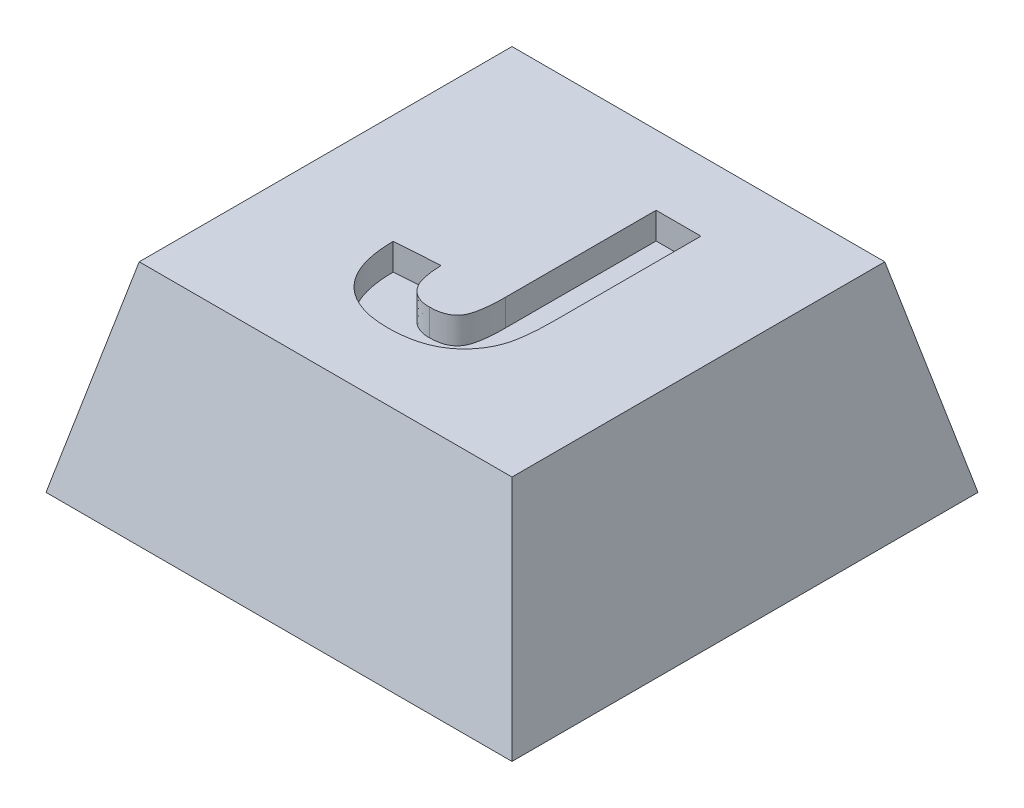
ISO-10303-21;
HEADER;
FILE_DESCRIPTION(('STEP AP214'),'2;1');
FILE_NAME('part.step','',(''),(''),'','','');
FILE_SCHEMA(('AUTOMOTIVE_DESIGN { 1 0 10303 214 1 1 1 1 }'));
ENDSEC;
DATA;
#1=APPLICATION_CONTEXT('core data for automotive mechanical design processes');
#2=APPLICATION_PROTOCOL_DEFINITION('international standard','automotive_design',2000,#1);
#3=PRODUCT_CONTEXT('',#1,'mechanical');
#4=PRODUCT('Part','Part','',(#3));
#5=PRODUCT_RELATED_PRODUCT_CATEGORY('part','',(#4));
#6=PRODUCT_DEFINITION_FORMATION('','',#4);
#7=PRODUCT_DEFINITION_CONTEXT('part definition',#1,'design');
#8=PRODUCT_DEFINITION('design','',#6,#7);
#9=PRODUCT_DEFINITION_SHAPE('','',#8);
#10=(LENGTH_UNIT() NAMED_UNIT(*) SI_UNIT(.MILLI.,.METRE.));
#11=(NAMED_UNIT(*) PLANE_ANGLE_UNIT() SI_UNIT($,.RADIAN.));
#12=(NAMED_UNIT(*) SI_UNIT($,.STERADIAN.) SOLID_ANGLE_UNIT());
#13=UNCERTAINTY_MEASURE_WITH_UNIT(LENGTH_MEASURE(1.E-05),#10,'distance_accuracy_value','');
#14=(GEOMETRIC_REPRESENTATION_CONTEXT(3) GLOBAL_UNCERTAINTY_ASSIGNED_CONTEXT((#13)) GLOBAL_UNIT_ASSIGNED_CONTEXT((#10,
#11,#12)) REPRESENTATION_CONTEXT('',''));
#15=CARTESIAN_POINT('',(0.,0.,0.));
#16=DIRECTION('',(0.,0.,1.));
#17=DIRECTION('',(1.,0.,0.));
#18=AXIS2_PLACEMENT_3D('',#15,#16,#17);
#19=CARTESIAN_POINT('',(0.,3.,0.));
#20=DIRECTION('',(0.,-1.,0.));
#21=DIRECTION('',(0.,0.,-1.));
#22=AXIS2_PLACEMENT_3D('',#19,#20,#21);
#23=PLANE('',#22);
#24=DIRECTION('',(-1.,0.,0.));
#25=VECTOR('',#24,1.);
#26=CARTESIAN_POINT('',(11.,3.,-0.7));
#27=LINE('',#26,#25);
#28=CARTESIAN_POINT('',(6.3,3.,-0.7));
#29=VERTEX_POINT('',#28);
#30=CARTESIAN_POINT('',(0.7,3.,-0.7));
#31=VERTEX_POINT('',#30);
#32=EDGE_CURVE('E65',#29,#31,#27,.T.);
#33=ORIENTED_EDGE('',*,*,#32,.F.);
#34=DIRECTION('',(0.,0.,1.));
#35=VECTOR('',#34,1.);
#36=CARTESIAN_POINT('',(6.3,3.,-7.));
#37=LINE('',#36,#35);
#38=CARTESIAN_POINT('',(6.3,3.,-6.3));
#39=VERTEX_POINT('',#38);
#40=EDGE_CURVE('E194',#39,#29,#37,.T.);
#41=ORIENTED_EDGE('',*,*,#40,.F.);
#42=DIRECTION('',(-1.,0.,0.));
#43=VECTOR('',#42,1.);
#44=CARTESIAN_POINT('',(11.,3.,-6.3));
#45=LINE('',#44,#43);
#46=CARTESIAN_POINT('',(0.699999999999998,3.,-6.3));
#47=VERTEX_POINT('',#46);
#48=EDGE_CURVE('E181',#39,#47,#45,.T.);
#49=ORIENTED_EDGE('',*,*,#48,.T.);
#50=DIRECTION('',(0.,0.,1.));
#51=VECTOR('',#50,1.);
#52=CARTESIAN_POINT('',(0.7,3.,-7.));
#53=LINE('',#52,#51);
#54=EDGE_CURVE('E195',#47,#31,#53,.T.);
#55=ORIENTED_EDGE('',*,*,#54,.T.);
#56=EDGE_LOOP('',(#33,#41,#49,#55));
#57=FACE_BOUND('',#56,.T.);
#58=DIRECTION('',(0.,0.,-1.));
#59=VECTOR('',#58,1.);
#60=CARTESIAN_POINT('',(3.91206739877753,3.,-2.98721086469881));
#61=LINE('',#60,#59);
#62=CARTESIAN_POINT('',(3.91206739877753,3.,-2.98721086469881));
#63=VERTEX_POINT('',#62);
#64=CARTESIAN_POINT('',(3.91206739877753,3.,-5.25253538392958));
#65=VERTEX_POINT('',#64);
#66=EDGE_CURVE('E58',#63,#65,#61,.T.);
#67=ORIENTED_EDGE('',*,*,#66,.T.);
#68=DIRECTION('',(1.,0.,0.));
#69=VECTOR('',#68,1.);
#70=CARTESIAN_POINT('',(3.91206739877753,3.,-5.25253538392958));
#71=LINE('',#70,#69);
#72=CARTESIAN_POINT('',(4.58514432185445,3.,-5.25253538392958));
#73=VERTEX_POINT('',#72);
#74=EDGE_CURVE('E165',#65,#73,#71,.T.);
#75=ORIENTED_EDGE('',*,*,#74,.T.);
#76=DIRECTION('',(0.,0.,1.));
#77=VECTOR('',#76,1.);
#78=CARTESIAN_POINT('',(4.58514432185445,3.,-5.25253538392958));
#79=LINE('',#78,#77);
#80=CARTESIAN_POINT('',(4.58514432185445,3.,-3.04610509546804));
#81=VERTEX_POINT('',#80);
#82=EDGE_CURVE('E522',#73,#81,#79,.T.);
#83=ORIENTED_EDGE('',*,*,#82,.T.);
#84=CARTESIAN_POINT('',(4.58514432185445,3.,-3.04610509546804));
#85=CARTESIAN_POINT('',(4.58484354051069,3.,-3.01104571157729));
#86=CARTESIAN_POINT('',(4.58425987213727,3.,-2.94301272351985));
#87=CARTESIAN_POINT('',(4.58067350615085,3.,-2.84412773321802));
#88=CARTESIAN_POINT('',(4.57533759844862,3.,-2.75151026547932));
#89=CARTESIAN_POINT('',(4.56712913665262,3.,-2.66517361345126));
#90=CARTESIAN_POINT('',(4.55556294752057,3.,-2.58530441611173));
#91=CARTESIAN_POINT('',(4.54330520071531,3.,-2.51126557935449));
#92=CARTESIAN_POINT('',(4.52842281599445,3.,-2.44343130714472));
#93=CARTESIAN_POINT('',(4.51508659844859,3.,-2.40099346894503));
#94=CARTESIAN_POINT('',(4.50872204621343,3.,-2.38074051213471));
#95=B_SPLINE_CURVE_WITH_KNOTS('',3,(#84,#85,#86,#87,#88,#89,#90,#91,#92,#93,#94),.UNSPECIFIED.,
.F.,.F.,(4,1,1,1,1,1,1,1,4),(0.,0.156452495119164,0.303597198546585,0.441515756123934,
0.57040444623701,0.690463066411907,0.801567510862614,0.905300439354284,1.),.UNSPECIFIED.);
#96=CARTESIAN_POINT('',(4.50872204621343,3.,-2.38074051213471));
#97=VERTEX_POINT('',#96);
#98=EDGE_CURVE('E517',#81,#97,#95,.T.);
#99=ORIENTED_EDGE('',*,*,#98,.T.);
#100=CARTESIAN_POINT('',(4.50872204621343,3.,-2.38074051213471));
#101=CARTESIAN_POINT('',(4.49982751326346,3.,-2.35578335197884));
#102=CARTESIAN_POINT('',(4.48222471894683,3.,-2.30639169089646));
#103=CARTESIAN_POINT('',(4.44801051336958,3.,-2.23593659718174));
#104=CARTESIAN_POINT('',(4.40866594413401,3.,-2.16923485230259));
#105=CARTESIAN_POINT('',(4.36430174050741,3.,-2.10599739743109));
#106=CARTESIAN_POINT('',(4.31533694466727,3.,-2.04597069021207));
#107=CARTESIAN_POINT('',(4.26011075922921,3.,-1.99073689447542));
#108=CARTESIAN_POINT('',(4.20056589190549,3.,-1.93836941226635));
#109=CARTESIAN_POINT('',(4.13502741336027,3.,-1.89103820407625));
#110=CARTESIAN_POINT('',(4.06514475981321,3.,-1.84690714592185));
#111=CARTESIAN_POINT('',(3.98892723647851,3.,-1.81013891859891));
#112=CARTESIAN_POINT('',(3.90787445383457,3.,-1.77833391503347));
#113=CARTESIAN_POINT('',(3.82130615826096,3.,-1.75250062571584));
#114=CARTESIAN_POINT('',(3.72919724773486,3.,-1.7322876400651));
#115=CARTESIAN_POINT('',(3.6317836932548,3.,-1.71757523362619));
#116=CARTESIAN_POINT('',(3.52893572474956,3.,-1.70921534010168));
#117=CARTESIAN_POINT('',(3.45869046084753,3.,-1.70818944091935));
#118=CARTESIAN_POINT('',(3.42268438595702,3.,-1.70766358905778));
#119=B_SPLINE_CURVE_WITH_KNOTS('',3,(#100,#101,#102,#103,#104,#105,#106,#107,#108,#109,#110,
#111,#112,#113,#114,#115,#116,#117,#118),.UNSPECIFIED.,.F.,.F.,(4,1,1,1,1,1,1,1,1,1,1,1,1,1,1,1,
4),(0.,0.0578458170130584,0.114480212135457,0.170784536242213,0.226875480201814,
0.283096404177707,0.339779109412981,0.397319931612097,0.456142184292489,0.516216371074673,
0.577640129433395,0.640691136416188,0.706271339139874,0.77477558408517,0.846550476911843,
0.921345373149547,1.),.UNSPECIFIED.);
#120=CARTESIAN_POINT('',(3.42268438595702,3.,-1.70766358905778));
#121=VERTEX_POINT('',#120);
#122=EDGE_CURVE('E507',#97,#121,#119,.T.);
#123=ORIENTED_EDGE('',*,*,#122,.T.);
#124=CARTESIAN_POINT('',(3.42268438595702,3.,-1.70766358905778));
#125=CARTESIAN_POINT('',(3.38058390407083,3.,-1.70868113625124));
#126=CARTESIAN_POINT('',(3.29873676866269,3.,-1.71065933980607));
#127=CARTESIAN_POINT('',(3.17971535800611,3.,-1.72379280482546));
#128=CARTESIAN_POINT('',(3.06809956119844,3.,-1.74676378840266));
#129=CARTESIAN_POINT('',(2.96422523456699,3.,-1.77994329234022));
#130=CARTESIAN_POINT('',(2.8670309569123,3.,-1.82118860041089));
#131=CARTESIAN_POINT('',(2.77769230806682,3.,-1.87263646132011));
#132=CARTESIAN_POINT('',(2.69573448445627,3.,-1.93325468982276));
#133=CARTESIAN_POINT('',(2.62169043984679,3.,-2.0032290785534));
#134=CARTESIAN_POINT('',(2.5555235708422,3.,-2.08185201462364));
#135=CARTESIAN_POINT('',(2.49840973269658,3.,-2.16981331462645));
#136=CARTESIAN_POINT('',(2.44993529695146,3.,-2.26619310147599));
#137=CARTESIAN_POINT('',(2.410873172898,3.,-2.37142739367569));
#138=CARTESIAN_POINT('',(2.3800335394126,3.,-2.48501237559787));
#139=CARTESIAN_POINT('',(2.35778934641552,3.,-2.60718720348745));
#140=CARTESIAN_POINT('',(2.34451597483478,3.,-2.73802144362846));
#141=CARTESIAN_POINT('',(2.34256059239478,3.,-2.82802487656406));
#142=CARTESIAN_POINT('',(2.34155457826471,3.,-2.87433025572445));
#143=B_SPLINE_CURVE_WITH_KNOTS('',3,(#124,#125,#126,#127,#128,#129,#130,#131,#132,#133,#134,
#135,#136,#137,#138,#139,#140,#141,#142),.UNSPECIFIED.,.F.,.F.,(4,1,1,1,1,1,1,1,1,1,1,1,1,1,1,1,
4),(0.,0.0696292858637476,0.135365614195809,0.197756356389333,0.257779246829448,
0.315436810851021,0.372058901761518,0.427875728209648,0.483657745283362,0.540176831628514,
0.597427412819986,0.65672025189341,0.718247696480561,0.782762362646519,0.851147772011753,
0.923417822731318,1.),.UNSPECIFIED.);
#144=CARTESIAN_POINT('',(2.34155457826471,3.,-2.87433025572445));
#145=VERTEX_POINT('',#144);
#146=EDGE_CURVE('E516',#121,#145,#143,.T.);
#147=ORIENTED_EDGE('',*,*,#146,.T.);
#148=DIRECTION('',(0.997785157856609,0.,-0.0665190105237732));
#149=VECTOR('',#148,1.);
#150=CARTESIAN_POINT('',(2.34155457826471,3.,-2.87433025572445));
#151=LINE('',#150,#149);
#152=CARTESIAN_POINT('',(3.01463150134163,3.,-2.91920205059624));
#153=VERTEX_POINT('',#152);
#154=EDGE_CURVE('E543',#145,#153,#151,.T.);
#155=ORIENTED_EDGE('',*,*,#154,.T.);
#156=CARTESIAN_POINT('',(3.01463150134163,3.,-2.91920205059624));
#157=CARTESIAN_POINT('',(3.01584036358571,3.,-2.89441584948431));
#158=CARTESIAN_POINT('',(3.01815842472874,3.,-2.846886918903));
#159=CARTESIAN_POINT('',(3.02459488525032,3.,-2.77837183449129));
#160=CARTESIAN_POINT('',(3.03273391836232,3.,-2.71539844353878));
#161=CARTESIAN_POINT('',(3.04338367481644,3.,-2.65815575709446));
#162=CARTESIAN_POINT('',(3.05485228726694,3.,-2.6061600898452));
#163=CARTESIAN_POINT('',(3.06975019425514,3.,-2.56043470110315));
#164=CARTESIAN_POINT('',(3.08541230352029,3.,-2.51937174878556));
#165=CARTESIAN_POINT('',(3.09916890630787,3.,-2.49534664863771));
#166=CARTESIAN_POINT('',(3.10577733467497,3.,-2.48380541598086));
#167=B_SPLINE_CURVE_WITH_KNOTS('',3,(#156,#157,#158,#159,#160,#161,#162,#163,#164,#165,#166),
.UNSPECIFIED.,.F.,.F.,(4,1,1,1,1,1,1,1,4),(0.,0.165826153270336,0.317980948018503,
0.459795738565098,0.589996550393839,0.707065953418222,0.815243566739462,0.911246281264676,1.),.UNSPECIFIED.);
#168=CARTESIAN_POINT('',(3.10577733467497,3.,-2.48380541598086));
#169=VERTEX_POINT('',#168);
#170=EDGE_CURVE('E550',#153,#169,#167,.T.);
#171=ORIENTED_EDGE('',*,*,#170,.T.);
#172=CARTESIAN_POINT('',(3.10577733467497,3.,-2.48380541598086));
#173=CARTESIAN_POINT('',(3.11589416626289,3.,-2.46854068254458));
#174=CARTESIAN_POINT('',(3.1358053509234,3.,-2.43849778585288));
#175=CARTESIAN_POINT('',(3.17212863049855,3.,-2.39934873072918));
#176=CARTESIAN_POINT('',(3.21112528718598,3.,-2.36512243873319));
#177=CARTESIAN_POINT('',(3.2549286769612,3.,-2.3382137089091));
#178=CARTESIAN_POINT('',(3.3023195286539,3.,-2.3170508020788));
#179=CARTESIAN_POINT('',(3.35365359949676,3.,-2.30167304466432));
#180=CARTESIAN_POINT('',(3.40878935654382,3.,-2.29234869756563));
#181=CARTESIAN_POINT('',(3.44671897227432,3.,-2.29145490016832));
#182=CARTESIAN_POINT('',(3.46615393723907,3.,-2.29099692239112));
#183=B_SPLINE_CURVE_WITH_KNOTS('',3,(#172,#173,#174,#175,#176,#177,#178,#179,#180,#181,#182),
.UNSPECIFIED.,.F.,.F.,(4,1,1,1,1,1,1,1,4),(0.,0.127957288456737,0.251835881320902,
0.372465314870914,0.490006212112382,0.610068863669226,0.734765287953249,0.864094923273421,1.),.UNSPECIFIED.);
#184=CARTESIAN_POINT('',(3.46615393723907,3.,-2.29099692239112));
#185=VERTEX_POINT('',#184);
#186=EDGE_CURVE('E556',#169,#185,#183,.T.);
#187=ORIENTED_EDGE('',*,*,#186,.T.);
#188=CARTESIAN_POINT('',(3.46615393723907,3.,-2.29099692239112));
#189=CARTESIAN_POINT('',(3.48580415906824,3.,-2.29136309783513));
#190=CARTESIAN_POINT('',(3.52357815374473,3.,-2.29206700384662));
#191=CARTESIAN_POINT('',(3.57801486363297,3.,-2.29846789306408));
#192=CARTESIAN_POINT('',(3.62806672151406,3.,-2.30883979766459));
#193=CARTESIAN_POINT('',(3.67376098927177,3.,-2.32341907552966));
#194=CARTESIAN_POINT('',(3.71525245136075,3.,-2.34234512119109));
#195=CARTESIAN_POINT('',(3.75162141095267,3.,-2.36655772147114));
#196=CARTESIAN_POINT('',(3.78443504567921,3.,-2.39380237695572));
#197=CARTESIAN_POINT('',(3.81278084621346,3.,-2.42657580731164));
#198=CARTESIAN_POINT('',(3.83693202342298,3.,-2.4660651639451));
#199=CARTESIAN_POINT('',(3.85709715915652,3.,-2.51412891771858));
#200=CARTESIAN_POINT('',(3.87444467749202,3.,-2.57096477005853));
#201=CARTESIAN_POINT('',(3.88785172262314,3.,-2.63700480732916));
#202=CARTESIAN_POINT('',(3.89926376245366,3.,-2.71161680033285));
#203=CARTESIAN_POINT('',(3.90642229812753,3.,-2.79546045245877));
#204=CARTESIAN_POINT('',(3.91156790528959,3.,-2.88828795951065));
#205=CARTESIAN_POINT('',(3.91189624696282,3.,-2.95331485774773));
#206=CARTESIAN_POINT('',(3.91206739877753,3.,-2.98721086469881));
#207=B_SPLINE_CURVE_WITH_KNOTS('',3,(#188,#189,#190,#191,#192,#193,#194,#195,#196,#197,#198,
#199,#200,#201,#202,#203,#204,#205,#206),.UNSPECIFIED.,.F.,.F.,(4,1,1,1,1,1,1,1,1,1,1,1,1,1,1,1,
4),(0.,0.0612696766946457,0.117779863322363,0.170676728222519,0.220468992129151,
0.267103819976365,0.312391821648744,0.356352173127523,0.399759083159082,0.446892572188991,
0.500109905692333,0.561902028042049,0.631955790870925,0.710098293176899,0.797211503732283,
0.894294200316469,1.),.UNSPECIFIED.);
#208=EDGE_CURVE('E161',#185,#63,#207,.T.);
#209=ORIENTED_EDGE('',*,*,#208,.T.);
#210=EDGE_LOOP('',(#67,#75,#83,#99,#123,#147,#155,#171,#187,#209));
#211=FACE_BOUND('',#210,.T.);
#212=ADVANCED_FACE('F42',(#57,#211),#23,.F.);
#213=CARTESIAN_POINT('',(7.,0.,-7.));
#214=DIRECTION('',(-0.973841209741793,-0.227229615606418,0.));
#215=DIRECTION('',(0.227229615606418,-0.973841209741793,0.));
#216=AXIS2_PLACEMENT_3D('',#213,#214,#215);
#217=PLANE('',#216);
#218=DIRECTION('',(-0.221581128241521,0.949633406749377,-0.221581128241521));
#219=VECTOR('',#218,1.);
#220=CARTESIAN_POINT('',(6.6563126252505,1.47294589178357,-0.343687374749499));
#221=LINE('',#220,#219);
#222=CARTESIAN_POINT('',(7.,0.,0.));
#223=VERTEX_POINT('',#222);
#224=EDGE_CURVE('E191',#223,#29,#221,.T.);
#225=ORIENTED_EDGE('',*,*,#224,.F.);
#226=DIRECTION('',(0.,0.,-1.));
#227=VECTOR('',#226,1.);
#228=CARTESIAN_POINT('',(7.,0.,0.));
#229=LINE('',#228,#227);
#230=CARTESIAN_POINT('',(7.,0.,-7.));
#231=VERTEX_POINT('',#230);
#232=EDGE_CURVE('E209',#223,#231,#229,.T.);
#233=ORIENTED_EDGE('',*,*,#232,.T.);
#234=DIRECTION('',(0.221581128241521,-0.949633406749377,-0.221581128241521));
#235=VECTOR('',#234,1.);
#236=CARTESIAN_POINT('',(7.,0.,-7.));
#237=LINE('',#236,#235);
#238=EDGE_CURVE('E185',#39,#231,#237,.T.);
#239=ORIENTED_EDGE('',*,*,#238,.F.);
#240=ORIENTED_EDGE('',*,*,#40,.T.);
#241=EDGE_LOOP('',(#225,#233,#239,#240));
#242=FACE_BOUND('',#241,.T.);
#243=ADVANCED_FACE('F234',(#242),#217,.F.);
#244=CARTESIAN_POINT('',(0.,0.,-7.));
#245=DIRECTION('',(0.973841209741793,-0.227229615606418,0.));
#246=DIRECTION('',(0.227229615606418,0.973841209741793,0.));
#247=AXIS2_PLACEMENT_3D('',#244,#245,#246);
#248=PLANE('',#247);
#249=DIRECTION('',(-0.221581128241521,-0.949633406749378,0.221581128241521));
#250=VECTOR('',#249,1.);
#251=CARTESIAN_POINT('',(0.343687374749499,1.47294589178357,-0.3436873747495));
#252=LINE('',#251,#250);
#253=CARTESIAN_POINT('',(0.,0.,0.));
#254=VERTEX_POINT('',#253);
#255=EDGE_CURVE('E11',#31,#254,#252,.T.);
#256=ORIENTED_EDGE('',*,*,#255,.F.);
#257=ORIENTED_EDGE('',*,*,#54,.F.);
#258=DIRECTION('',(0.221581128241521,0.949633406749377,0.221581128241521));
#259=VECTOR('',#258,1.);
#260=CARTESIAN_POINT('',(0.,0.,-7.));
#261=LINE('',#260,#259);
#262=CARTESIAN_POINT('',(0.,0.,-7.));
#263=VERTEX_POINT('',#262);
#264=EDGE_CURVE('E51',#263,#47,#261,.T.);
#265=ORIENTED_EDGE('',*,*,#264,.F.);
#266=DIRECTION('',(0.,0.,1.));
#267=VECTOR('',#266,1.);
#268=CARTESIAN_POINT('',(0.,0.,0.));
#269=LINE('',#268,#267);
#270=EDGE_CURVE('E199',#263,#254,#269,.T.);
#271=ORIENTED_EDGE('',*,*,#270,.T.);
#272=EDGE_LOOP('',(#256,#257,#265,#271));
#273=FACE_BOUND('',#272,.T.);
#274=ADVANCED_FACE('F227',(#273),#248,.F.);
#275=CARTESIAN_POINT('',(0.,0.,0.));
#276=DIRECTION('',(0.,-1.,0.));
#277=DIRECTION('',(0.,0.,-1.));
#278=AXIS2_PLACEMENT_3D('',#275,#276,#277);
#279=PLANE('',#278);
#280=CARTESIAN_POINT('',(3.5,0.,-3.5));
#281=DIRECTION('',(0.,-1.,0.));
#282=DIRECTION('',(0.,0.,-1.));
#283=AXIS2_PLACEMENT_3D('',#280,#281,#282);
#284=CIRCLE('',#283,1.8);
#285=CARTESIAN_POINT('',(3.5,0.,-5.3));
#286=VERTEX_POINT('',#285);
#287=EDGE_CURVE('E167',#286,#286,#284,.T.);
#288=ORIENTED_EDGE('',*,*,#287,.F.);
#289=EDGE_LOOP('',(#288));
#290=FACE_BOUND('',#289,.T.);
#291=ORIENTED_EDGE('',*,*,#270,.F.);
#292=DIRECTION('',(-1.,0.,0.));
#293=VECTOR('',#292,1.);
#294=CARTESIAN_POINT('',(0.,0.,-7.));
#295=LINE('',#294,#293);
#296=EDGE_CURVE('E213',#231,#263,#295,.T.);
#297=ORIENTED_EDGE('',*,*,#296,.F.);
#298=ORIENTED_EDGE('',*,*,#232,.F.);
#299=DIRECTION('',(1.,0.,0.));
#300=VECTOR('',#299,1.);
#301=CARTESIAN_POINT('',(0.,0.,0.));
#302=LINE('',#301,#300);
#303=EDGE_CURVE('E206',#254,#223,#302,.T.);
#304=ORIENTED_EDGE('',*,*,#303,.F.);
#305=EDGE_LOOP('',(#291,#297,#298,#304));
#306=FACE_BOUND('',#305,.T.);
#307=ADVANCED_FACE('F44',(#290,#306),#279,.T.);
#308=CARTESIAN_POINT('',(11.,3.,-6.3));
#309=DIRECTION('',(0.,0.227229615606418,-0.973841209741793));
#310=DIRECTION('',(0.,0.973841209741793,0.227229615606418));
#311=AXIS2_PLACEMENT_3D('',#308,#309,#310);
#312=PLANE('',#311);
#313=ORIENTED_EDGE('',*,*,#238,.T.);
#314=ORIENTED_EDGE('',*,*,#296,.T.);
#315=ORIENTED_EDGE('',*,*,#264,.T.);
#316=ORIENTED_EDGE('',*,*,#48,.F.);
#317=EDGE_LOOP('',(#313,#314,#315,#316));
#318=FACE_BOUND('',#317,.T.);
#319=ADVANCED_FACE('F218',(#318),#312,.T.);
#320=CARTESIAN_POINT('',(11.,0.,0.));
#321=DIRECTION('',(0.,0.227229615606418,0.973841209741793));
#322=DIRECTION('',(0.,-0.973841209741793,0.227229615606418));
#323=AXIS2_PLACEMENT_3D('',#320,#321,#322);
#324=PLANE('',#323);
#325=ORIENTED_EDGE('',*,*,#224,.T.);
#326=ORIENTED_EDGE('',*,*,#32,.T.);
#327=ORIENTED_EDGE('',*,*,#255,.T.);
#328=ORIENTED_EDGE('',*,*,#303,.T.);
#329=EDGE_LOOP('',(#325,#326,#327,#328));
#330=FACE_BOUND('',#329,.T.);
#331=ADVANCED_FACE('F229',(#330),#324,.T.);
#332=CARTESIAN_POINT('',(3.5,0.8,-3.5));
#333=DIRECTION('',(0.,-1.,0.));
#334=DIRECTION('',(0.,0.,-1.));
#335=AXIS2_PLACEMENT_3D('',#332,#333,#334);
#336=CYLINDRICAL_SURFACE('',#335,1.8);
#337=CARTESIAN_POINT('',(3.5,0.8,-3.5));
#338=DIRECTION('',(0.,-1.,0.));
#339=DIRECTION('',(0.,0.,-1.));
#340=AXIS2_PLACEMENT_3D('',#337,#338,#339);
#341=CIRCLE('',#340,1.8);
#342=CARTESIAN_POINT('',(3.5,0.8,-5.3));
#343=VERTEX_POINT('',#342);
#344=EDGE_CURVE('E173',#343,#343,#341,.T.);
#345=ORIENTED_EDGE('',*,*,#344,.F.);
#346=EDGE_LOOP('',(#345));
#347=FACE_BOUND('',#346,.T.);
#348=ORIENTED_EDGE('',*,*,#287,.T.);
#349=EDGE_LOOP('',(#348));
#350=FACE_BOUND('',#349,.T.);
#351=ADVANCED_FACE('F254',(#347,#350),#336,.F.);
#352=CARTESIAN_POINT('',(3.5,0.8,-3.5));
#353=DIRECTION('',(0.,-1.,0.));
#354=DIRECTION('',(0.,0.,-1.));
#355=AXIS2_PLACEMENT_3D('',#352,#353,#354);
#356=PLANE('',#355);
#357=ORIENTED_EDGE('',*,*,#344,.T.);
#358=EDGE_LOOP('',(#357));
#359=FACE_BOUND('',#358,.T.);
#360=ADVANCED_FACE('F257',(#359),#356,.T.);
#361=CARTESIAN_POINT('',(3.91206739877753,2.6,-2.98721086469881));
#362=DIRECTION('',(1.,0.,0.));
#363=DIRECTION('',(0.,0.,-1.));
#364=AXIS2_PLACEMENT_3D('',#361,#362,#363);
#365=PLANE('',#364);
#366=ORIENTED_EDGE('',*,*,#66,.F.);
#367=DIRECTION('',(0.,1.,0.));
#368=VECTOR('',#367,1.);
#369=CARTESIAN_POINT('',(3.91206739877753,2.6,-2.98721086469881));
#370=LINE('',#369,#368);
#371=CARTESIAN_POINT('',(3.91206739877753,2.6,-2.98721086469881));
#372=VERTEX_POINT('',#371);
#373=EDGE_CURVE('E159',#372,#63,#370,.T.);
#374=ORIENTED_EDGE('',*,*,#373,.F.);
#375=DIRECTION('',(0.,0.,-1.));
#376=VECTOR('',#375,1.);
#377=CARTESIAN_POINT('',(3.91206739877753,2.6,-2.98721086469881));
#378=LINE('',#377,#376);
#379=CARTESIAN_POINT('',(3.91206739877753,2.6,-5.25253538392958));
#380=VERTEX_POINT('',#379);
#381=EDGE_CURVE('E149',#372,#380,#378,.T.);
#382=ORIENTED_EDGE('',*,*,#381,.T.);
#383=DIRECTION('',(0.,1.,0.));
#384=VECTOR('',#383,1.);
#385=CARTESIAN_POINT('',(3.91206739877753,2.6,-5.25253538392958));
#386=LINE('',#385,#384);
#387=EDGE_CURVE('E158',#380,#65,#386,.T.);
#388=ORIENTED_EDGE('',*,*,#387,.T.);
#389=EDGE_LOOP('',(#366,#374,#382,#388));
#390=FACE_BOUND('',#389,.T.);
#391=ADVANCED_FACE('F157',(#390),#365,.T.);
#392=CARTESIAN_POINT('',(3.91206739877753,2.6,-5.25253538392958));
#393=DIRECTION('',(0.,0.,1.));
#394=DIRECTION('',(1.,0.,0.));
#395=AXIS2_PLACEMENT_3D('',#392,#393,#394);
#396=PLANE('',#395);
#397=ORIENTED_EDGE('',*,*,#74,.F.);
#398=ORIENTED_EDGE('',*,*,#387,.F.);
#399=DIRECTION('',(1.,0.,0.));
#400=VECTOR('',#399,1.);
#401=CARTESIAN_POINT('',(3.91206739877753,2.6,-5.25253538392958));
#402=LINE('',#401,#400);
#403=CARTESIAN_POINT('',(4.58514432185445,2.6,-5.25253538392958));
#404=VERTEX_POINT('',#403);
#405=EDGE_CURVE('E145',#380,#404,#402,.T.);
#406=ORIENTED_EDGE('',*,*,#405,.T.);
#407=DIRECTION('',(0.,1.,0.));
#408=VECTOR('',#407,1.);
#409=CARTESIAN_POINT('',(4.58514432185445,2.6,-5.25253538392958));
#410=LINE('',#409,#408);
#411=EDGE_CURVE('E168',#404,#73,#410,.T.);
#412=ORIENTED_EDGE('',*,*,#411,.T.);
#413=EDGE_LOOP('',(#397,#398,#406,#412));
#414=FACE_BOUND('',#413,.T.);
#415=ADVANCED_FACE('F163',(#414),#396,.T.);
#416=CARTESIAN_POINT('',(4.58514432185445,2.6,-5.25253538392958));
#417=DIRECTION('',(-1.,0.,0.));
#418=DIRECTION('',(0.,0.,1.));
#419=AXIS2_PLACEMENT_3D('',#416,#417,#418);
#420=PLANE('',#419);
#421=ORIENTED_EDGE('',*,*,#82,.F.);
#422=ORIENTED_EDGE('',*,*,#411,.F.);
#423=DIRECTION('',(0.,0.,1.));
#424=VECTOR('',#423,1.);
#425=CARTESIAN_POINT('',(4.58514432185445,2.6,-5.25253538392958));
#426=LINE('',#425,#424);
#427=CARTESIAN_POINT('',(4.58514432185445,2.6,-3.04610509546804));
#428=VERTEX_POINT('',#427);
#429=EDGE_CURVE('E151',#404,#428,#426,.T.);
#430=ORIENTED_EDGE('',*,*,#429,.T.);
#431=DIRECTION('',(0.,1.,0.));
#432=VECTOR('',#431,1.);
#433=CARTESIAN_POINT('',(4.58514432185445,2.6,-3.04610509546804));
#434=LINE('',#433,#432);
#435=EDGE_CURVE('E175',#428,#81,#434,.T.);
#436=ORIENTED_EDGE('',*,*,#435,.T.);
#437=EDGE_LOOP('',(#421,#422,#430,#436));
#438=FACE_BOUND('',#437,.T.);
#439=ADVANCED_FACE('F266',(#438),#420,.T.);
#440=CARTESIAN_POINT('',(4.58514432185445,2.6,-3.04610509546804));
#441=CARTESIAN_POINT('',(4.58484354051069,2.6,-3.01104571157729));
#442=CARTESIAN_POINT('',(4.58425987213727,2.6,-2.94301272351985));
#443=CARTESIAN_POINT('',(4.58067350615085,2.6,-2.84412773321802));
#444=CARTESIAN_POINT('',(4.57533759844862,2.6,-2.75151026547932));
#445=CARTESIAN_POINT('',(4.56712913665262,2.6,-2.66517361345126));
#446=CARTESIAN_POINT('',(4.55556294752057,2.6,-2.58530441611173));
#447=CARTESIAN_POINT('',(4.54330520071531,2.6,-2.51126557935449));
#448=CARTESIAN_POINT('',(4.52842281599445,2.6,-2.44343130714472));
#449=CARTESIAN_POINT('',(4.51508659844859,2.6,-2.40099346894503));
#450=CARTESIAN_POINT('',(4.50872204621343,2.6,-2.38074051213471));
#451=B_SPLINE_CURVE_WITH_KNOTS('',3,(#440,#441,#442,#443,#444,#445,#446,#447,#448,#449,#450),
.UNSPECIFIED.,.F.,.F.,(4,1,1,1,1,1,1,1,4),(0.,0.156452495119164,0.303597198546585,
0.441515756123934,0.57040444623701,0.690463066411907,0.801567510862614,0.905300439354284,1.),.UNSPECIFIED.);
#452=DIRECTION('',(0.,1.,0.));
#453=VECTOR('',#452,1.);
#454=SURFACE_OF_LINEAR_EXTRUSION('',#451,#453);
#455=ORIENTED_EDGE('',*,*,#98,.F.);
#456=ORIENTED_EDGE('',*,*,#435,.F.);
#457=CARTESIAN_POINT('',(4.50872204621343,2.6,-2.38074051213471));
#458=VERTEX_POINT('',#457);
#459=EDGE_CURVE('E278',#428,#458,#451,.T.);
#460=ORIENTED_EDGE('',*,*,#459,.T.);
#461=DIRECTION('',(0.,1.,0.));
#462=VECTOR('',#461,1.);
#463=CARTESIAN_POINT('',(4.50872204621343,2.6,-2.38074051213471));
#464=LINE('',#463,#462);
#465=EDGE_CURVE('E509',#458,#97,#464,.T.);
#466=ORIENTED_EDGE('',*,*,#465,.T.);
#467=EDGE_LOOP('',(#455,#456,#460,#466));
#468=FACE_BOUND('',#467,.T.);
#469=ADVANCED_FACE('F269',(#468),#454,.T.);
#470=CARTESIAN_POINT('',(4.50872204621343,2.6,-2.38074051213471));
#471=CARTESIAN_POINT('',(4.49982751326346,2.6,-2.35578335197884));
#472=CARTESIAN_POINT('',(4.48222471894683,2.6,-2.30639169089646));
#473=CARTESIAN_POINT('',(4.44801051336958,2.6,-2.23593659718174));
#474=CARTESIAN_POINT('',(4.40866594413401,2.6,-2.16923485230259));
#475=CARTESIAN_POINT('',(4.36430174050741,2.6,-2.10599739743109));
#476=CARTESIAN_POINT('',(4.31533694466727,2.6,-2.04597069021207));
#477=CARTESIAN_POINT('',(4.26011075922921,2.6,-1.99073689447542));
#478=CARTESIAN_POINT('',(4.20056589190549,2.6,-1.93836941226635));
#479=CARTESIAN_POINT('',(4.13502741336027,2.6,-1.89103820407625));
#480=CARTESIAN_POINT('',(4.06514475981321,2.6,-1.84690714592185));
#481=CARTESIAN_POINT('',(3.98892723647851,2.6,-1.81013891859891));
#482=CARTESIAN_POINT('',(3.90787445383457,2.6,-1.77833391503347));
#483=CARTESIAN_POINT('',(3.82130615826096,2.6,-1.75250062571584));
#484=CARTESIAN_POINT('',(3.72919724773486,2.6,-1.7322876400651));
#485=CARTESIAN_POINT('',(3.6317836932548,2.6,-1.71757523362619));
#486=CARTESIAN_POINT('',(3.52893572474956,2.6,-1.70921534010168));
#487=CARTESIAN_POINT('',(3.45869046084753,2.6,-1.70818944091935));
#488=CARTESIAN_POINT('',(3.42268438595702,2.6,-1.70766358905778));
#489=B_SPLINE_CURVE_WITH_KNOTS('',3,(#470,#471,#472,#473,#474,#475,#476,#477,#478,#479,#480,
#481,#482,#483,#484,#485,#486,#487,#488),.UNSPECIFIED.,.F.,.F.,(4,1,1,1,1,1,1,1,1,1,1,1,1,1,1,1,
4),(0.,0.0578458170130584,0.114480212135457,0.170784536242213,0.226875480201814,
0.283096404177707,0.339779109412981,0.397319931612097,0.456142184292489,0.516216371074673,
0.577640129433395,0.640691136416188,0.706271339139874,0.77477558408517,0.846550476911843,
0.921345373149547,1.),.UNSPECIFIED.);
#490=DIRECTION('',(0.,1.,0.));
#491=VECTOR('',#490,1.);
#492=SURFACE_OF_LINEAR_EXTRUSION('',#489,#491);
#493=ORIENTED_EDGE('',*,*,#122,.F.);
#494=ORIENTED_EDGE('',*,*,#465,.F.);
#495=CARTESIAN_POINT('',(3.42268438595702,2.6,-1.70766358905778));
#496=VERTEX_POINT('',#495);
#497=EDGE_CURVE('E284',#458,#496,#489,.T.);
#498=ORIENTED_EDGE('',*,*,#497,.T.);
#499=DIRECTION('',(0.,1.,0.));
#500=VECTOR('',#499,1.);
#501=CARTESIAN_POINT('',(3.42268438595702,2.6,-1.70766358905778));
#502=LINE('',#501,#500);
#503=EDGE_CURVE('E512',#496,#121,#502,.T.);
#504=ORIENTED_EDGE('',*,*,#503,.T.);
#505=EDGE_LOOP('',(#493,#494,#498,#504));
#506=FACE_BOUND('',#505,.T.);
#507=ADVANCED_FACE('F274',(#506),#492,.T.);
#508=CARTESIAN_POINT('',(3.42268438595702,2.6,-1.70766358905778));
#509=CARTESIAN_POINT('',(3.38058390407083,2.6,-1.70868113625124));
#510=CARTESIAN_POINT('',(3.29873676866269,2.6,-1.71065933980607));
#511=CARTESIAN_POINT('',(3.17971535800611,2.6,-1.72379280482546));
#512=CARTESIAN_POINT('',(3.06809956119844,2.6,-1.74676378840266));
#513=CARTESIAN_POINT('',(2.96422523456699,2.6,-1.77994329234022));
#514=CARTESIAN_POINT('',(2.8670309569123,2.6,-1.82118860041089));
#515=CARTESIAN_POINT('',(2.77769230806682,2.6,-1.87263646132011));
#516=CARTESIAN_POINT('',(2.69573448445627,2.6,-1.93325468982276));
#517=CARTESIAN_POINT('',(2.62169043984679,2.6,-2.0032290785534));
#518=CARTESIAN_POINT('',(2.5555235708422,2.6,-2.08185201462364));
#519=CARTESIAN_POINT('',(2.49840973269658,2.6,-2.16981331462645));
#520=CARTESIAN_POINT('',(2.44993529695146,2.6,-2.26619310147599));
#521=CARTESIAN_POINT('',(2.410873172898,2.6,-2.37142739367569));
#522=CARTESIAN_POINT('',(2.3800335394126,2.6,-2.48501237559787));
#523=CARTESIAN_POINT('',(2.35778934641552,2.6,-2.60718720348745));
#524=CARTESIAN_POINT('',(2.34451597483478,2.6,-2.73802144362846));
#525=CARTESIAN_POINT('',(2.34256059239478,2.6,-2.82802487656406));
#526=CARTESIAN_POINT('',(2.34155457826471,2.6,-2.87433025572445));
#527=B_SPLINE_CURVE_WITH_KNOTS('',3,(#508,#509,#510,#511,#512,#513,#514,#515,#516,#517,#518,
#519,#520,#521,#522,#523,#524,#525,#526),.UNSPECIFIED.,.F.,.F.,(4,1,1,1,1,1,1,1,1,1,1,1,1,1,1,1,
4),(0.,0.0696292858637476,0.135365614195809,0.197756356389333,0.257779246829448,
0.315436810851021,0.372058901761518,0.427875728209648,0.483657745283362,0.540176831628514,
0.597427412819986,0.65672025189341,0.718247696480561,0.782762362646519,0.851147772011753,
0.923417822731318,1.),.UNSPECIFIED.);
#528=DIRECTION('',(0.,1.,0.));
#529=VECTOR('',#528,1.);
#530=SURFACE_OF_LINEAR_EXTRUSION('',#527,#529);
#531=ORIENTED_EDGE('',*,*,#146,.F.);
#532=ORIENTED_EDGE('',*,*,#503,.F.);
#533=CARTESIAN_POINT('',(2.34155457826471,2.6,-2.87433025572445));
#534=VERTEX_POINT('',#533);
#535=EDGE_CURVE('E293',#496,#534,#527,.T.);
#536=ORIENTED_EDGE('',*,*,#535,.T.);
#537=DIRECTION('',(0.,1.,0.));
#538=VECTOR('',#537,1.);
#539=CARTESIAN_POINT('',(2.34155457826471,2.6,-2.87433025572445));
#540=LINE('',#539,#538);
#541=EDGE_CURVE('E587',#534,#145,#540,.T.);
#542=ORIENTED_EDGE('',*,*,#541,.T.);
#543=EDGE_LOOP('',(#531,#532,#536,#542));
#544=FACE_BOUND('',#543,.T.);
#545=ADVANCED_FACE('F307',(#544),#530,.T.);
#546=CARTESIAN_POINT('',(2.34155457826471,2.6,-2.87433025572445));
#547=DIRECTION('',(0.0665190105237732,0.,0.997785157856609));
#548=DIRECTION('',(0.997785157856609,0.,-0.0665190105237733));
#549=AXIS2_PLACEMENT_3D('',#546,#547,#548);
#550=PLANE('',#549);
#551=ORIENTED_EDGE('',*,*,#154,.F.);
#552=ORIENTED_EDGE('',*,*,#541,.F.);
#553=DIRECTION('',(0.997785157856609,0.,-0.0665190105237732));
#554=VECTOR('',#553,1.);
#555=CARTESIAN_POINT('',(2.34155457826471,2.6,-2.87433025572445));
#556=LINE('',#555,#554);
#557=CARTESIAN_POINT('',(3.01463150134163,2.6,-2.91920205059624));
#558=VERTEX_POINT('',#557);
#559=EDGE_CURVE('E302',#534,#558,#556,.T.);
#560=ORIENTED_EDGE('',*,*,#559,.T.);
#561=DIRECTION('',(0.,1.,0.));
#562=VECTOR('',#561,1.);
#563=CARTESIAN_POINT('',(3.01463150134163,2.6,-2.91920205059624));
#564=LINE('',#563,#562);
#565=EDGE_CURVE('E584',#558,#153,#564,.T.);
#566=ORIENTED_EDGE('',*,*,#565,.T.);
#567=EDGE_LOOP('',(#551,#552,#560,#566));
#568=FACE_BOUND('',#567,.T.);
#569=ADVANCED_FACE('F310',(#568),#550,.T.);
#570=CARTESIAN_POINT('',(3.01463150134163,2.6,-2.91920205059624));
#571=CARTESIAN_POINT('',(3.01584036358571,2.6,-2.89441584948431));
#572=CARTESIAN_POINT('',(3.01815842472874,2.6,-2.846886918903));
#573=CARTESIAN_POINT('',(3.02459488525032,2.6,-2.77837183449129));
#574=CARTESIAN_POINT('',(3.03273391836232,2.6,-2.71539844353878));
#575=CARTESIAN_POINT('',(3.04338367481644,2.6,-2.65815575709446));
#576=CARTESIAN_POINT('',(3.05485228726694,2.6,-2.6061600898452));
#577=CARTESIAN_POINT('',(3.06975019425514,2.6,-2.56043470110315));
#578=CARTESIAN_POINT('',(3.08541230352029,2.6,-2.51937174878556));
#579=CARTESIAN_POINT('',(3.09916890630787,2.6,-2.49534664863771));
#580=CARTESIAN_POINT('',(3.10577733467497,2.6,-2.48380541598086));
#581=B_SPLINE_CURVE_WITH_KNOTS('',3,(#570,#571,#572,#573,#574,#575,#576,#577,#578,#579,#580),
.UNSPECIFIED.,.F.,.F.,(4,1,1,1,1,1,1,1,4),(0.,0.165826153270336,0.317980948018503,
0.459795738565098,0.589996550393839,0.707065953418222,0.815243566739462,0.911246281264676,1.),.UNSPECIFIED.);
#582=DIRECTION('',(0.,1.,0.));
#583=VECTOR('',#582,1.);
#584=SURFACE_OF_LINEAR_EXTRUSION('',#581,#583);
#585=ORIENTED_EDGE('',*,*,#170,.F.);
#586=ORIENTED_EDGE('',*,*,#565,.F.);
#587=CARTESIAN_POINT('',(3.10577733467497,2.6,-2.48380541598086));
#588=VERTEX_POINT('',#587);
#589=EDGE_CURVE('E322',#558,#588,#581,.T.);
#590=ORIENTED_EDGE('',*,*,#589,.T.);
#591=DIRECTION('',(0.,1.,0.));
#592=VECTOR('',#591,1.);
#593=CARTESIAN_POINT('',(3.10577733467497,2.6,-2.48380541598086));
#594=LINE('',#593,#592);
#595=EDGE_CURVE('E581',#588,#169,#594,.T.);
#596=ORIENTED_EDGE('',*,*,#595,.T.);
#597=EDGE_LOOP('',(#585,#586,#590,#596));
#598=FACE_BOUND('',#597,.T.);
#599=ADVANCED_FACE('F314',(#598),#584,.T.);
#600=CARTESIAN_POINT('',(3.10577733467497,2.6,-2.48380541598086));
#601=CARTESIAN_POINT('',(3.11589416626289,2.6,-2.46854068254458));
#602=CARTESIAN_POINT('',(3.1358053509234,2.6,-2.43849778585288));
#603=CARTESIAN_POINT('',(3.17212863049855,2.6,-2.39934873072918));
#604=CARTESIAN_POINT('',(3.21112528718598,2.6,-2.36512243873319));
#605=CARTESIAN_POINT('',(3.2549286769612,2.6,-2.3382137089091));
#606=CARTESIAN_POINT('',(3.3023195286539,2.6,-2.3170508020788));
#607=CARTESIAN_POINT('',(3.35365359949676,2.6,-2.30167304466432));
#608=CARTESIAN_POINT('',(3.40878935654382,2.6,-2.29234869756563));
#609=CARTESIAN_POINT('',(3.44671897227432,2.6,-2.29145490016832));
#610=CARTESIAN_POINT('',(3.46615393723907,2.6,-2.29099692239112));
#611=B_SPLINE_CURVE_WITH_KNOTS('',3,(#600,#601,#602,#603,#604,#605,#606,#607,#608,#609,#610),
.UNSPECIFIED.,.F.,.F.,(4,1,1,1,1,1,1,1,4),(0.,0.127957288456737,0.251835881320902,
0.372465314870914,0.490006212112382,0.610068863669226,0.734765287953249,0.864094923273421,1.),.UNSPECIFIED.);
#612=DIRECTION('',(0.,1.,0.));
#613=VECTOR('',#612,1.);
#614=SURFACE_OF_LINEAR_EXTRUSION('',#611,#613);
#615=ORIENTED_EDGE('',*,*,#186,.F.);
#616=ORIENTED_EDGE('',*,*,#595,.F.);
#617=CARTESIAN_POINT('',(3.46615393723907,2.6,-2.29099692239112));
#618=VERTEX_POINT('',#617);
#619=EDGE_CURVE('E327',#588,#618,#611,.T.);
#620=ORIENTED_EDGE('',*,*,#619,.T.);
#621=DIRECTION('',(0.,1.,0.));
#622=VECTOR('',#621,1.);
#623=CARTESIAN_POINT('',(3.46615393723907,2.6,-2.29099692239112));
#624=LINE('',#623,#622);
#625=EDGE_CURVE('E578',#618,#185,#624,.T.);
#626=ORIENTED_EDGE('',*,*,#625,.T.);
#627=EDGE_LOOP('',(#615,#616,#620,#626));
#628=FACE_BOUND('',#627,.T.);
#629=ADVANCED_FACE('F318',(#628),#614,.T.);
#630=CARTESIAN_POINT('',(3.46615393723907,2.6,-2.29099692239112));
#631=CARTESIAN_POINT('',(3.48580415906824,2.6,-2.29136309783513));
#632=CARTESIAN_POINT('',(3.52357815374473,2.6,-2.29206700384662));
#633=CARTESIAN_POINT('',(3.57801486363297,2.6,-2.29846789306408));
#634=CARTESIAN_POINT('',(3.62806672151406,2.6,-2.30883979766459));
#635=CARTESIAN_POINT('',(3.67376098927177,2.6,-2.32341907552966));
#636=CARTESIAN_POINT('',(3.71525245136075,2.6,-2.34234512119109));
#637=CARTESIAN_POINT('',(3.75162141095267,2.6,-2.36655772147114));
#638=CARTESIAN_POINT('',(3.78443504567921,2.6,-2.39380237695572));
#639=CARTESIAN_POINT('',(3.81278084621346,2.6,-2.42657580731164));
#640=CARTESIAN_POINT('',(3.83693202342298,2.6,-2.4660651639451));
#641=CARTESIAN_POINT('',(3.85709715915652,2.6,-2.51412891771858));
#642=CARTESIAN_POINT('',(3.87444467749202,2.6,-2.57096477005853));
#643=CARTESIAN_POINT('',(3.88785172262314,2.6,-2.63700480732916));
#644=CARTESIAN_POINT('',(3.89926376245366,2.6,-2.71161680033285));
#645=CARTESIAN_POINT('',(3.90642229812753,2.6,-2.79546045245877));
#646=CARTESIAN_POINT('',(3.91156790528959,2.6,-2.88828795951065));
#647=CARTESIAN_POINT('',(3.91189624696282,2.6,-2.95331485774773));
#648=CARTESIAN_POINT('',(3.91206739877753,2.6,-2.98721086469881));
#649=B_SPLINE_CURVE_WITH_KNOTS('',3,(#630,#631,#632,#633,#634,#635,#636,#637,#638,#639,#640,
#641,#642,#643,#644,#645,#646,#647,#648),.UNSPECIFIED.,.F.,.F.,(4,1,1,1,1,1,1,1,1,1,1,1,1,1,1,1,
4),(0.,0.0612696766946457,0.117779863322363,0.170676728222519,0.220468992129151,
0.267103819976365,0.312391821648744,0.356352173127523,0.399759083159082,0.446892572188991,
0.500109905692333,0.561902028042049,0.631955790870925,0.710098293176899,0.797211503732283,
0.894294200316469,1.),.UNSPECIFIED.);
#650=DIRECTION('',(0.,1.,0.));
#651=VECTOR('',#650,1.);
#652=SURFACE_OF_LINEAR_EXTRUSION('',#649,#651);
#653=ORIENTED_EDGE('',*,*,#208,.F.);
#654=ORIENTED_EDGE('',*,*,#625,.F.);
#655=EDGE_CURVE('E336',#618,#372,#649,.T.);
#656=ORIENTED_EDGE('',*,*,#655,.T.);
#657=ORIENTED_EDGE('',*,*,#373,.T.);
#658=EDGE_LOOP('',(#653,#654,#656,#657));
#659=FACE_BOUND('',#658,.T.);
#660=ADVANCED_FACE('F349',(#659),#652,.T.);
#661=CARTESIAN_POINT('',(4.57127077230404,2.6,-2.71035353687172));
#662=DIRECTION('',(-1.22928608891538E-12,1.,0.));
#663=DIRECTION('',(-1.,-1.22928608891538E-12,0.));
#664=AXIS2_PLACEMENT_3D('',#661,#662,#663);
#665=PLANE('',#664);
#666=ORIENTED_EDGE('',*,*,#381,.F.);
#667=ORIENTED_EDGE('',*,*,#655,.F.);
#668=ORIENTED_EDGE('',*,*,#619,.F.);
#669=ORIENTED_EDGE('',*,*,#589,.F.);
#670=ORIENTED_EDGE('',*,*,#559,.F.);
#671=ORIENTED_EDGE('',*,*,#535,.F.);
#672=ORIENTED_EDGE('',*,*,#497,.F.);
#673=ORIENTED_EDGE('',*,*,#459,.F.);
#674=ORIENTED_EDGE('',*,*,#429,.F.);
#675=ORIENTED_EDGE('',*,*,#405,.F.);
#676=EDGE_LOOP('',(#666,#667,#668,#669,#670,#671,#672,#673,#674,#675));
#677=FACE_BOUND('',#676,.T.);
#678=ADVANCED_FACE('F147',(#677),#665,.T.);
#679=CLOSED_SHELL('',(#212,#243,#274,#307,#319,#331,#351,#360,#391,#415,#439,#469,#507,#545,
#569,#599,#629,#660,#678));
#680=MANIFOLD_SOLID_BREP('B2',#679);
#681=ADVANCED_BREP_SHAPE_REPRESENTATION('',(#18,#680),#14);
#682=SHAPE_DEFINITION_REPRESENTATION(#9,#681);
ENDSEC;
END-ISO-10303-21;
